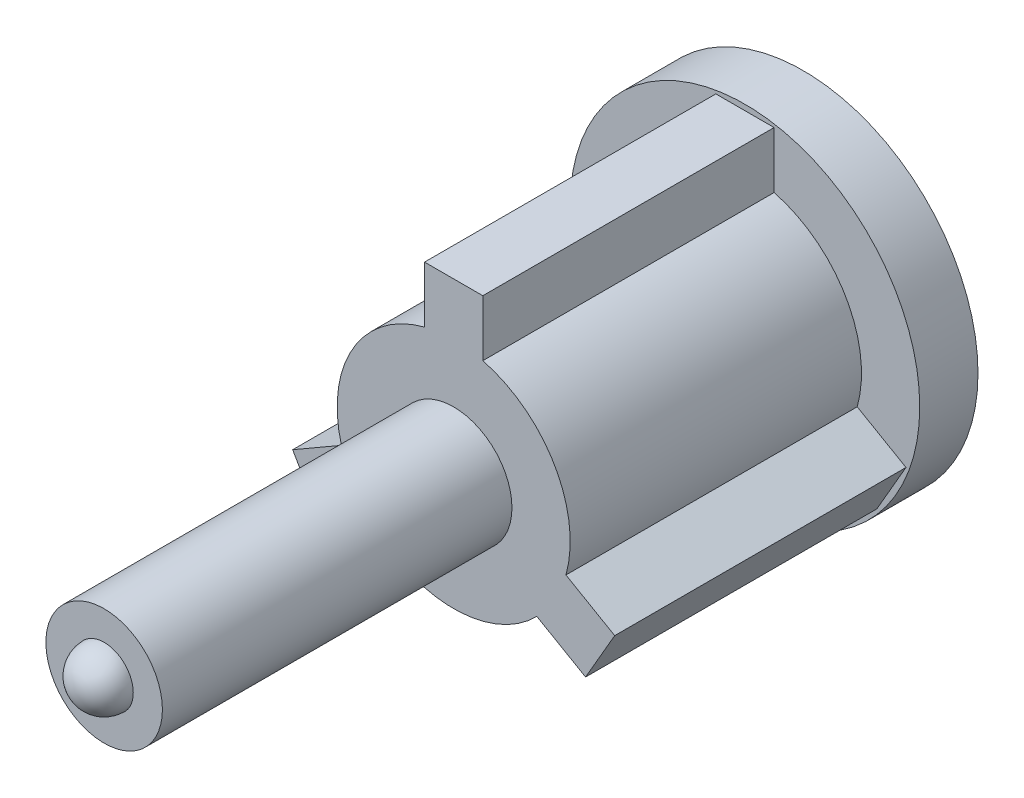
ISO-10303-21;
HEADER;
FILE_DESCRIPTION(('STEP AP214'),'2;1');
FILE_NAME('part.step','',(''),(''),'','','');
FILE_SCHEMA(('AUTOMOTIVE_DESIGN { 1 0 10303 214 1 1 1 1 }'));
ENDSEC;
DATA;
#1=APPLICATION_CONTEXT('core data for automotive mechanical design processes');
#2=APPLICATION_PROTOCOL_DEFINITION('international standard','automotive_design',2000,#1);
#3=PRODUCT_CONTEXT('',#1,'mechanical');
#4=PRODUCT('Part','Part','',(#3));
#5=PRODUCT_RELATED_PRODUCT_CATEGORY('part','',(#4));
#6=PRODUCT_DEFINITION_FORMATION('','',#4);
#7=PRODUCT_DEFINITION_CONTEXT('part definition',#1,'design');
#8=PRODUCT_DEFINITION('design','',#6,#7);
#9=PRODUCT_DEFINITION_SHAPE('','',#8);
#10=(LENGTH_UNIT() NAMED_UNIT(*) SI_UNIT(.MILLI.,.METRE.));
#11=(NAMED_UNIT(*) PLANE_ANGLE_UNIT() SI_UNIT($,.RADIAN.));
#12=(NAMED_UNIT(*) SI_UNIT($,.STERADIAN.) SOLID_ANGLE_UNIT());
#13=UNCERTAINTY_MEASURE_WITH_UNIT(LENGTH_MEASURE(1.E-05),#10,'distance_accuracy_value','');
#14=(GEOMETRIC_REPRESENTATION_CONTEXT(3) GLOBAL_UNCERTAINTY_ASSIGNED_CONTEXT((#13)) GLOBAL_UNIT_ASSIGNED_CONTEXT((#10,
#11,#12)) REPRESENTATION_CONTEXT('',''));
#15=CARTESIAN_POINT('',(0.,0.,0.));
#16=DIRECTION('',(0.,0.,1.));
#17=DIRECTION('',(1.,0.,0.));
#18=AXIS2_PLACEMENT_3D('',#15,#16,#17);
#19=CARTESIAN_POINT('',(0.,0.,1.));
#20=DIRECTION('',(0.,0.,1.));
#21=DIRECTION('',(1.,0.,0.));
#22=AXIS2_PLACEMENT_3D('',#19,#20,#21);
#23=PLANE('',#22);
#24=CARTESIAN_POINT('',(0.,0.,1.));
#25=DIRECTION('',(0.,0.,1.));
#26=DIRECTION('',(1.,0.,0.));
#27=AXIS2_PLACEMENT_3D('',#24,#25,#26);
#28=CIRCLE('',#27,3.);
#29=CARTESIAN_POINT('',(3.,0.,1.));
#30=VERTEX_POINT('',#29);
#31=EDGE_CURVE('E212',#30,#30,#28,.T.);
#32=ORIENTED_EDGE('',*,*,#31,.T.);
#33=EDGE_LOOP('',(#32));
#34=FACE_BOUND('',#33,.T.);
#35=DIRECTION('',(0.499999999999992,-0.866025403784443,0.));
#36=VECTOR('',#35,1.);
#37=CARTESIAN_POINT('',(-2.26381957910646,-1.88436711258346,1.));
#38=LINE('',#37,#36);
#39=CARTESIAN_POINT('',(-2.76381957910646,-1.01834170879901,1.));
#40=VERTEX_POINT('',#39);
#41=CARTESIAN_POINT('',(-2.26381957910646,-1.88436711258346,1.));
#42=VERTEX_POINT('',#41);
#43=EDGE_CURVE('E298',#40,#42,#38,.T.);
#44=ORIENTED_EDGE('',*,*,#43,.F.);
#45=DIRECTION('',(-0.866025403784443,-0.499999999999992,0.));
#46=VECTOR('',#45,1.);
#47=CARTESIAN_POINT('',(-2.76381957910646,-1.01834170879901,1.));
#48=LINE('',#47,#46);
#49=CARTESIAN_POINT('',(-1.92705098312485,-0.535233134659617,1.));
#50=VERTEX_POINT('',#49);
#51=EDGE_CURVE('E145',#50,#40,#48,.T.);
#52=ORIENTED_EDGE('',*,*,#51,.F.);
#53=CARTESIAN_POINT('',(0.,0.,1.));
#54=DIRECTION('',(0.,0.,1.));
#55=DIRECTION('',(1.,0.,0.));
#56=AXIS2_PLACEMENT_3D('',#53,#54,#55);
#57=CIRCLE('',#56,2.);
#58=CARTESIAN_POINT('',(-0.5,1.93649167310371,1.));
#59=VERTEX_POINT('',#58);
#60=EDGE_CURVE('E206',#59,#50,#57,.T.);
#61=ORIENTED_EDGE('',*,*,#60,.F.);
#62=DIRECTION('',(0.,-1.,0.));
#63=VECTOR('',#62,1.);
#64=CARTESIAN_POINT('',(-0.5,2.90270882138252,1.));
#65=LINE('',#64,#63);
#66=CARTESIAN_POINT('',(-0.5,2.90270882138252,1.));
#67=VERTEX_POINT('',#66);
#68=EDGE_CURVE('E180',#67,#59,#65,.T.);
#69=ORIENTED_EDGE('',*,*,#68,.F.);
#70=DIRECTION('',(-1.,0.,0.));
#71=VECTOR('',#70,1.);
#72=CARTESIAN_POINT('',(-0.5,2.90270882138252,1.));
#73=LINE('',#72,#71);
#74=CARTESIAN_POINT('',(0.5,2.90270882138252,1.));
#75=VERTEX_POINT('',#74);
#76=EDGE_CURVE('E186',#75,#67,#73,.T.);
#77=ORIENTED_EDGE('',*,*,#76,.F.);
#78=DIRECTION('',(0.,1.,0.));
#79=VECTOR('',#78,1.);
#80=CARTESIAN_POINT('',(0.5,2.90270882138252,1.));
#81=LINE('',#80,#79);
#82=CARTESIAN_POINT('',(0.5,1.93649167310371,1.));
#83=VERTEX_POINT('',#82);
#84=EDGE_CURVE('E176',#83,#75,#81,.T.);
#85=ORIENTED_EDGE('',*,*,#84,.F.);
#86=CARTESIAN_POINT('',(1.92705098312484,-0.535233134659643,1.));
#87=VERTEX_POINT('',#86);
#88=EDGE_CURVE('E211',#87,#83,#57,.T.);
#89=ORIENTED_EDGE('',*,*,#88,.F.);
#90=DIRECTION('',(-0.866025403784436,0.500000000000004,0.));
#91=VECTOR('',#90,1.);
#92=CARTESIAN_POINT('',(2.76381957910644,-1.01834170879905,1.));
#93=LINE('',#92,#91);
#94=CARTESIAN_POINT('',(2.76381957910644,-1.01834170879905,1.));
#95=VERTEX_POINT('',#94);
#96=EDGE_CURVE('E158',#95,#87,#93,.T.);
#97=ORIENTED_EDGE('',*,*,#96,.F.);
#98=DIRECTION('',(0.500000000000004,0.866025403784436,0.));
#99=VECTOR('',#98,1.);
#100=CARTESIAN_POINT('',(2.76381957910644,-1.01834170879905,1.));
#101=LINE('',#100,#99);
#102=CARTESIAN_POINT('',(2.26381957910644,-1.88436711258349,1.));
#103=VERTEX_POINT('',#102);
#104=EDGE_CURVE('E163',#103,#95,#101,.T.);
#105=ORIENTED_EDGE('',*,*,#104,.F.);
#106=DIRECTION('',(0.866025403784436,-0.500000000000004,0.));
#107=VECTOR('',#106,1.);
#108=CARTESIAN_POINT('',(2.26381957910644,-1.88436711258349,1.));
#109=LINE('',#108,#107);
#110=CARTESIAN_POINT('',(1.42705098312484,-1.40125853844408,1.));
#111=VERTEX_POINT('',#110);
#112=EDGE_CURVE('E154',#111,#103,#109,.T.);
#113=ORIENTED_EDGE('',*,*,#112,.F.);
#114=CARTESIAN_POINT('',(-1.42705098312486,-1.40125853844406,1.));
#115=VERTEX_POINT('',#114);
#116=EDGE_CURVE('E210',#115,#111,#57,.T.);
#117=ORIENTED_EDGE('',*,*,#116,.F.);
#118=DIRECTION('',(0.866025403784443,0.499999999999992,0.));
#119=VECTOR('',#118,1.);
#120=CARTESIAN_POINT('',(-2.26381957910646,-1.88436711258346,1.));
#121=LINE('',#120,#119);
#122=EDGE_CURVE('E133',#42,#115,#121,.T.);
#123=ORIENTED_EDGE('',*,*,#122,.F.);
#124=EDGE_LOOP('',(#44,#52,#61,#69,#77,#85,#89,#97,#105,#113,#117,#123));
#125=FACE_BOUND('',#124,.T.);
#126=ADVANCED_FACE('F34',(#34,#125),#23,.T.);
#127=CARTESIAN_POINT('',(0.,0.,6.));
#128=DIRECTION('',(0.,0.,-1.));
#129=DIRECTION('',(-1.,0.,0.));
#130=AXIS2_PLACEMENT_3D('',#127,#128,#129);
#131=CYLINDRICAL_SURFACE('',#130,2.);
#132=DIRECTION('',(0.,0.,-1.));
#133=VECTOR('',#132,1.);
#134=CARTESIAN_POINT('',(-1.92705098312485,-0.535233134659617,6.));
#135=LINE('',#134,#133);
#136=CARTESIAN_POINT('',(-1.92705098312485,-0.535233134659617,6.));
#137=VERTEX_POINT('',#136);
#138=EDGE_CURVE('E148',#137,#50,#135,.T.);
#139=ORIENTED_EDGE('',*,*,#138,.F.);
#140=CARTESIAN_POINT('',(0.,0.,6.));
#141=DIRECTION('',(0.,0.,1.));
#142=DIRECTION('',(1.,0.,0.));
#143=AXIS2_PLACEMENT_3D('',#140,#141,#142);
#144=CIRCLE('',#143,2.);
#145=CARTESIAN_POINT('',(-0.5,1.93649167310371,6.));
#146=VERTEX_POINT('',#145);
#147=EDGE_CURVE('E129',#146,#137,#144,.T.);
#148=ORIENTED_EDGE('',*,*,#147,.F.);
#149=DIRECTION('',(0.,0.,-1.));
#150=VECTOR('',#149,1.);
#151=CARTESIAN_POINT('',(-0.5,1.93649167310371,6.));
#152=LINE('',#151,#150);
#153=EDGE_CURVE('E194',#59,#146,#152,.F.);
#154=ORIENTED_EDGE('',*,*,#153,.F.);
#155=ORIENTED_EDGE('',*,*,#60,.T.);
#156=EDGE_LOOP('',(#139,#148,#154,#155));
#157=FACE_BOUND('',#156,.T.);
#158=ADVANCED_FACE('F236',(#157),#131,.T.);
#159=DIRECTION('',(0.,0.,-1.));
#160=VECTOR('',#159,1.);
#161=CARTESIAN_POINT('',(-1.42705098312486,-1.40125853844406,6.));
#162=LINE('',#161,#160);
#163=CARTESIAN_POINT('',(-1.42705098312486,-1.40125853844406,6.));
#164=VERTEX_POINT('',#163);
#165=EDGE_CURVE('E146',#115,#164,#162,.F.);
#166=ORIENTED_EDGE('',*,*,#165,.F.);
#167=ORIENTED_EDGE('',*,*,#116,.T.);
#168=DIRECTION('',(0.,0.,-1.));
#169=VECTOR('',#168,1.);
#170=CARTESIAN_POINT('',(1.42705098312484,-1.40125853844408,6.));
#171=LINE('',#170,#169);
#172=CARTESIAN_POINT('',(1.42705098312484,-1.40125853844408,6.));
#173=VERTEX_POINT('',#172);
#174=EDGE_CURVE('E173',#173,#111,#171,.T.);
#175=ORIENTED_EDGE('',*,*,#174,.F.);
#176=EDGE_CURVE('E208',#164,#173,#144,.T.);
#177=ORIENTED_EDGE('',*,*,#176,.F.);
#178=EDGE_LOOP('',(#166,#167,#175,#177));
#179=FACE_BOUND('',#178,.T.);
#180=ADVANCED_FACE('F240',(#179),#131,.T.);
#181=DIRECTION('',(0.,0.,-1.));
#182=VECTOR('',#181,1.);
#183=CARTESIAN_POINT('',(1.92705098312484,-0.535233134659643,6.));
#184=LINE('',#183,#182);
#185=CARTESIAN_POINT('',(1.92705098312484,-0.535233134659643,6.));
#186=VERTEX_POINT('',#185);
#187=EDGE_CURVE('E171',#87,#186,#184,.F.);
#188=ORIENTED_EDGE('',*,*,#187,.F.);
#189=ORIENTED_EDGE('',*,*,#88,.T.);
#190=DIRECTION('',(0.,0.,-1.));
#191=VECTOR('',#190,1.);
#192=CARTESIAN_POINT('',(0.5,1.93649167310371,6.));
#193=LINE('',#192,#191);
#194=CARTESIAN_POINT('',(0.5,1.93649167310371,6.));
#195=VERTEX_POINT('',#194);
#196=EDGE_CURVE('E197',#195,#83,#193,.T.);
#197=ORIENTED_EDGE('',*,*,#196,.F.);
#198=EDGE_CURVE('E203',#186,#195,#144,.T.);
#199=ORIENTED_EDGE('',*,*,#198,.F.);
#200=EDGE_LOOP('',(#188,#189,#197,#199));
#201=FACE_BOUND('',#200,.T.);
#202=ADVANCED_FACE('F231',(#201),#131,.T.);
#203=CARTESIAN_POINT('',(0.,0.,1.));
#204=DIRECTION('',(0.,0.,-1.));
#205=DIRECTION('',(-1.,0.,0.));
#206=AXIS2_PLACEMENT_3D('',#203,#204,#205);
#207=CYLINDRICAL_SURFACE('',#206,3.);
#208=ORIENTED_EDGE('',*,*,#31,.F.);
#209=EDGE_LOOP('',(#208));
#210=FACE_BOUND('',#209,.T.);
#211=CARTESIAN_POINT('',(0.,0.,0.));
#212=DIRECTION('',(0.,0.,1.));
#213=DIRECTION('',(1.,0.,0.));
#214=AXIS2_PLACEMENT_3D('',#211,#212,#213);
#215=CIRCLE('',#214,3.);
#216=CARTESIAN_POINT('',(3.,0.,0.));
#217=VERTEX_POINT('',#216);
#218=EDGE_CURVE('E38',#217,#217,#215,.T.);
#219=ORIENTED_EDGE('',*,*,#218,.T.);
#220=EDGE_LOOP('',(#219));
#221=FACE_BOUND('',#220,.T.);
#222=ADVANCED_FACE('F219',(#210,#221),#207,.T.);
#223=CARTESIAN_POINT('',(0.,0.,0.));
#224=DIRECTION('',(0.,0.,1.));
#225=DIRECTION('',(1.,0.,0.));
#226=AXIS2_PLACEMENT_3D('',#223,#224,#225);
#227=PLANE('',#226);
#228=CARTESIAN_POINT('',(0.,0.,0.));
#229=DIRECTION('',(0.,0.,-1.));
#230=DIRECTION('',(-1.,0.,0.));
#231=AXIS2_PLACEMENT_3D('',#228,#229,#230);
#232=CIRCLE('',#231,1.5);
#233=CARTESIAN_POINT('',(-1.5,0.,0.));
#234=VERTEX_POINT('',#233);
#235=EDGE_CURVE('E296',#234,#234,#232,.T.);
#236=ORIENTED_EDGE('',*,*,#235,.F.);
#237=EDGE_LOOP('',(#236));
#238=FACE_BOUND('',#237,.T.);
#239=ORIENTED_EDGE('',*,*,#218,.F.);
#240=EDGE_LOOP('',(#239));
#241=FACE_BOUND('',#240,.T.);
#242=ADVANCED_FACE('F221',(#238,#241),#227,.F.);
#243=CARTESIAN_POINT('',(0.,0.,6.));
#244=DIRECTION('',(0.,0.,1.));
#245=DIRECTION('',(1.,0.,0.));
#246=AXIS2_PLACEMENT_3D('',#243,#244,#245);
#247=PLANE('',#246);
#248=ORIENTED_EDGE('',*,*,#147,.T.);
#249=DIRECTION('',(-0.866025403784443,-0.499999999999992,0.));
#250=VECTOR('',#249,1.);
#251=CARTESIAN_POINT('',(-2.76381957910646,-1.01834170879901,6.));
#252=LINE('',#251,#250);
#253=CARTESIAN_POINT('',(-2.76381957910646,-1.01834170879901,6.));
#254=VERTEX_POINT('',#253);
#255=EDGE_CURVE('E122',#137,#254,#252,.T.);
#256=ORIENTED_EDGE('',*,*,#255,.T.);
#257=DIRECTION('',(0.499999999999992,-0.866025403784443,0.));
#258=VECTOR('',#257,1.);
#259=CARTESIAN_POINT('',(-2.26381957910646,-1.88436711258346,6.));
#260=LINE('',#259,#258);
#261=CARTESIAN_POINT('',(-2.26381957910646,-1.88436711258346,6.));
#262=VERTEX_POINT('',#261);
#263=EDGE_CURVE('E126',#254,#262,#260,.T.);
#264=ORIENTED_EDGE('',*,*,#263,.T.);
#265=DIRECTION('',(0.866025403784443,0.499999999999992,0.));
#266=VECTOR('',#265,1.);
#267=CARTESIAN_POINT('',(-2.26381957910646,-1.88436711258346,6.));
#268=LINE('',#267,#266);
#269=EDGE_CURVE('E51',#262,#164,#268,.T.);
#270=ORIENTED_EDGE('',*,*,#269,.T.);
#271=ORIENTED_EDGE('',*,*,#176,.T.);
#272=DIRECTION('',(0.866025403784436,-0.500000000000004,0.));
#273=VECTOR('',#272,1.);
#274=CARTESIAN_POINT('',(2.26381957910644,-1.88436711258349,6.));
#275=LINE('',#274,#273);
#276=CARTESIAN_POINT('',(2.26381957910644,-1.88436711258349,6.));
#277=VERTEX_POINT('',#276);
#278=EDGE_CURVE('E155',#173,#277,#275,.T.);
#279=ORIENTED_EDGE('',*,*,#278,.T.);
#280=DIRECTION('',(0.500000000000004,0.866025403784436,0.));
#281=VECTOR('',#280,1.);
#282=CARTESIAN_POINT('',(2.76381957910644,-1.01834170879905,6.));
#283=LINE('',#282,#281);
#284=CARTESIAN_POINT('',(2.76381957910644,-1.01834170879905,6.));
#285=VERTEX_POINT('',#284);
#286=EDGE_CURVE('E157',#277,#285,#283,.T.);
#287=ORIENTED_EDGE('',*,*,#286,.T.);
#288=DIRECTION('',(-0.866025403784436,0.500000000000004,0.));
#289=VECTOR('',#288,1.);
#290=CARTESIAN_POINT('',(2.76381957910644,-1.01834170879905,6.));
#291=LINE('',#290,#289);
#292=EDGE_CURVE('E58',#285,#186,#291,.T.);
#293=ORIENTED_EDGE('',*,*,#292,.T.);
#294=ORIENTED_EDGE('',*,*,#198,.T.);
#295=DIRECTION('',(0.,1.,0.));
#296=VECTOR('',#295,1.);
#297=CARTESIAN_POINT('',(0.5,2.90270882138252,6.));
#298=LINE('',#297,#296);
#299=CARTESIAN_POINT('',(0.5,2.90270882138252,6.));
#300=VERTEX_POINT('',#299);
#301=EDGE_CURVE('E177',#195,#300,#298,.T.);
#302=ORIENTED_EDGE('',*,*,#301,.T.);
#303=DIRECTION('',(-1.,0.,0.));
#304=VECTOR('',#303,1.);
#305=CARTESIAN_POINT('',(-0.5,2.90270882138252,6.));
#306=LINE('',#305,#304);
#307=CARTESIAN_POINT('',(-0.5,2.90270882138252,6.));
#308=VERTEX_POINT('',#307);
#309=EDGE_CURVE('E179',#300,#308,#306,.T.);
#310=ORIENTED_EDGE('',*,*,#309,.T.);
#311=DIRECTION('',(0.,-1.,0.));
#312=VECTOR('',#311,1.);
#313=CARTESIAN_POINT('',(-0.5,2.90270882138252,6.));
#314=LINE('',#313,#312);
#315=EDGE_CURVE('E182',#308,#146,#314,.T.);
#316=ORIENTED_EDGE('',*,*,#315,.T.);
#317=EDGE_LOOP('',(#248,#256,#264,#270,#271,#279,#287,#293,#294,#302,#310,#316));
#318=FACE_BOUND('',#317,.T.);
#319=CARTESIAN_POINT('',(0.,0.,6.));
#320=DIRECTION('',(0.,0.,1.));
#321=DIRECTION('',(1.,0.,0.));
#322=AXIS2_PLACEMENT_3D('',#319,#320,#321);
#323=CIRCLE('',#322,1.);
#324=CARTESIAN_POINT('',(1.,0.,6.));
#325=VERTEX_POINT('',#324);
#326=EDGE_CURVE('E43',#325,#325,#323,.T.);
#327=ORIENTED_EDGE('',*,*,#326,.F.);
#328=EDGE_LOOP('',(#327));
#329=FACE_BOUND('',#328,.T.);
#330=ADVANCED_FACE('F124',(#318,#329),#247,.T.);
#331=CARTESIAN_POINT('',(0.,0.,12.));
#332=DIRECTION('',(0.,0.,-1.));
#333=DIRECTION('',(-1.,0.,0.));
#334=AXIS2_PLACEMENT_3D('',#331,#332,#333);
#335=CYLINDRICAL_SURFACE('',#334,1.);
#336=CARTESIAN_POINT('',(0.,0.,12.));
#337=DIRECTION('',(0.,0.,1.));
#338=DIRECTION('',(1.,0.,0.));
#339=AXIS2_PLACEMENT_3D('',#336,#337,#338);
#340=CIRCLE('',#339,1.);
#341=CARTESIAN_POINT('',(1.,0.,12.));
#342=VERTEX_POINT('',#341);
#343=EDGE_CURVE('E199',#342,#342,#340,.T.);
#344=ORIENTED_EDGE('',*,*,#343,.F.);
#345=EDGE_LOOP('',(#344));
#346=FACE_BOUND('',#345,.T.);
#347=ORIENTED_EDGE('',*,*,#326,.T.);
#348=EDGE_LOOP('',(#347));
#349=FACE_BOUND('',#348,.T.);
#350=ADVANCED_FACE('F229',(#346,#349),#335,.T.);
#351=CARTESIAN_POINT('',(0.,0.,12.));
#352=DIRECTION('',(0.,0.,1.));
#353=DIRECTION('',(1.,0.,0.));
#354=AXIS2_PLACEMENT_3D('',#351,#352,#353);
#355=PLANE('',#354);
#356=CARTESIAN_POINT('',(0.,0.,12.));
#357=DIRECTION('',(0.,0.,1.));
#358=DIRECTION('',(1.,0.,0.));
#359=AXIS2_PLACEMENT_3D('',#356,#357,#358);
#360=CIRCLE('',#359,0.5);
#361=CARTESIAN_POINT('',(0.5,0.,12.));
#362=VERTEX_POINT('',#361);
#363=EDGE_CURVE('E11',#362,#362,#360,.T.);
#364=ORIENTED_EDGE('',*,*,#363,.F.);
#365=EDGE_LOOP('',(#364));
#366=FACE_BOUND('',#365,.T.);
#367=ORIENTED_EDGE('',*,*,#343,.T.);
#368=EDGE_LOOP('',(#367));
#369=FACE_BOUND('',#368,.T.);
#370=ADVANCED_FACE('F247',(#366,#369),#355,.T.);
#371=CARTESIAN_POINT('',(0.,0.,12.));
#372=DIRECTION('',(0.,0.,1.));
#373=DIRECTION('',(1.,0.,0.));
#374=AXIS2_PLACEMENT_3D('',#371,#372,#373);
#375=SPHERICAL_SURFACE('',#374,0.5);
#376=ORIENTED_EDGE('',*,*,#363,.T.);
#377=EDGE_LOOP('',(#376));
#378=FACE_BOUND('',#377,.T.);
#379=ADVANCED_FACE('F36',(#378),#375,.T.);
#380=CARTESIAN_POINT('',(0.5,2.90270882138252,6.));
#381=DIRECTION('',(-1.,0.,0.));
#382=DIRECTION('',(0.,-1.,0.));
#383=AXIS2_PLACEMENT_3D('',#380,#381,#382);
#384=PLANE('',#383);
#385=ORIENTED_EDGE('',*,*,#301,.F.);
#386=ORIENTED_EDGE('',*,*,#196,.T.);
#387=ORIENTED_EDGE('',*,*,#84,.T.);
#388=DIRECTION('',(0.,0.,-1.));
#389=VECTOR('',#388,1.);
#390=CARTESIAN_POINT('',(0.5,2.90270882138252,6.));
#391=LINE('',#390,#389);
#392=EDGE_CURVE('E191',#300,#75,#391,.T.);
#393=ORIENTED_EDGE('',*,*,#392,.F.);
#394=EDGE_LOOP('',(#385,#386,#387,#393));
#395=FACE_BOUND('',#394,.T.);
#396=ADVANCED_FACE('F252',(#395),#384,.F.);
#397=CARTESIAN_POINT('',(-0.5,2.90270882138252,6.));
#398=DIRECTION('',(1.,0.,0.));
#399=DIRECTION('',(0.,0.,-1.));
#400=AXIS2_PLACEMENT_3D('',#397,#398,#399);
#401=PLANE('',#400);
#402=ORIENTED_EDGE('',*,*,#68,.T.);
#403=ORIENTED_EDGE('',*,*,#153,.T.);
#404=ORIENTED_EDGE('',*,*,#315,.F.);
#405=DIRECTION('',(0.,0.,-1.));
#406=VECTOR('',#405,1.);
#407=CARTESIAN_POINT('',(-0.5,2.90270882138252,6.));
#408=LINE('',#407,#406);
#409=EDGE_CURVE('E184',#308,#67,#408,.T.);
#410=ORIENTED_EDGE('',*,*,#409,.T.);
#411=EDGE_LOOP('',(#402,#403,#404,#410));
#412=FACE_BOUND('',#411,.T.);
#413=ADVANCED_FACE('F255',(#412),#401,.F.);
#414=CARTESIAN_POINT('',(-0.5,2.90270882138252,6.));
#415=DIRECTION('',(0.,-1.,0.));
#416=DIRECTION('',(0.,0.,-1.));
#417=AXIS2_PLACEMENT_3D('',#414,#415,#416);
#418=PLANE('',#417);
#419=ORIENTED_EDGE('',*,*,#76,.T.);
#420=ORIENTED_EDGE('',*,*,#409,.F.);
#421=ORIENTED_EDGE('',*,*,#309,.F.);
#422=ORIENTED_EDGE('',*,*,#392,.T.);
#423=EDGE_LOOP('',(#419,#420,#421,#422));
#424=FACE_BOUND('',#423,.T.);
#425=ADVANCED_FACE('F257',(#424),#418,.F.);
#426=CARTESIAN_POINT('',(2.26381957910644,-1.88436711258349,6.));
#427=DIRECTION('',(0.500000000000004,0.866025403784436,0.));
#428=DIRECTION('',(-0.866025403784436,0.500000000000004,0.));
#429=AXIS2_PLACEMENT_3D('',#426,#427,#428);
#430=PLANE('',#429);
#431=ORIENTED_EDGE('',*,*,#278,.F.);
#432=ORIENTED_EDGE('',*,*,#174,.T.);
#433=ORIENTED_EDGE('',*,*,#112,.T.);
#434=DIRECTION('',(0.,0.,-1.));
#435=VECTOR('',#434,1.);
#436=CARTESIAN_POINT('',(2.26381957910644,-1.88436711258349,6.));
#437=LINE('',#436,#435);
#438=EDGE_CURVE('E168',#277,#103,#437,.T.);
#439=ORIENTED_EDGE('',*,*,#438,.F.);
#440=EDGE_LOOP('',(#431,#432,#433,#439));
#441=FACE_BOUND('',#440,.T.);
#442=ADVANCED_FACE('F260',(#441),#430,.F.);
#443=CARTESIAN_POINT('',(2.76381957910644,-1.01834170879905,6.));
#444=DIRECTION('',(-0.500000000000004,-0.866025403784436,0.));
#445=DIRECTION('',(0.866025403784436,-0.500000000000004,0.));
#446=AXIS2_PLACEMENT_3D('',#443,#444,#445);
#447=PLANE('',#446);
#448=ORIENTED_EDGE('',*,*,#96,.T.);
#449=ORIENTED_EDGE('',*,*,#187,.T.);
#450=ORIENTED_EDGE('',*,*,#292,.F.);
#451=DIRECTION('',(0.,0.,-1.));
#452=VECTOR('',#451,1.);
#453=CARTESIAN_POINT('',(2.76381957910644,-1.01834170879905,6.));
#454=LINE('',#453,#452);
#455=EDGE_CURVE('E161',#285,#95,#454,.T.);
#456=ORIENTED_EDGE('',*,*,#455,.T.);
#457=EDGE_LOOP('',(#448,#449,#450,#456));
#458=FACE_BOUND('',#457,.T.);
#459=ADVANCED_FACE('F267',(#458),#447,.F.);
#460=CARTESIAN_POINT('',(2.76381957910644,-1.01834170879905,6.));
#461=DIRECTION('',(-0.866025403784436,0.500000000000004,0.));
#462=DIRECTION('',(-0.500000000000004,-0.866025403784436,0.));
#463=AXIS2_PLACEMENT_3D('',#460,#461,#462);
#464=PLANE('',#463);
#465=ORIENTED_EDGE('',*,*,#104,.T.);
#466=ORIENTED_EDGE('',*,*,#455,.F.);
#467=ORIENTED_EDGE('',*,*,#286,.F.);
#468=ORIENTED_EDGE('',*,*,#438,.T.);
#469=EDGE_LOOP('',(#465,#466,#467,#468));
#470=FACE_BOUND('',#469,.T.);
#471=ADVANCED_FACE('F269',(#470),#464,.F.);
#472=CARTESIAN_POINT('',(-2.76381957910646,-1.01834170879901,6.));
#473=DIRECTION('',(0.499999999999992,-0.866025403784443,0.));
#474=DIRECTION('',(0.866025403784443,0.499999999999992,0.));
#475=AXIS2_PLACEMENT_3D('',#472,#473,#474);
#476=PLANE('',#475);
#477=ORIENTED_EDGE('',*,*,#255,.F.);
#478=ORIENTED_EDGE('',*,*,#138,.T.);
#479=ORIENTED_EDGE('',*,*,#51,.T.);
#480=DIRECTION('',(0.,0.,-1.));
#481=VECTOR('',#480,1.);
#482=CARTESIAN_POINT('',(-2.76381957910646,-1.01834170879901,6.));
#483=LINE('',#482,#481);
#484=EDGE_CURVE('E138',#254,#40,#483,.T.);
#485=ORIENTED_EDGE('',*,*,#484,.F.);
#486=EDGE_LOOP('',(#477,#478,#479,#485));
#487=FACE_BOUND('',#486,.T.);
#488=ADVANCED_FACE('F143',(#487),#476,.F.);
#489=CARTESIAN_POINT('',(-2.26381957910646,-1.88436711258346,6.));
#490=DIRECTION('',(-0.499999999999992,0.866025403784443,0.));
#491=DIRECTION('',(-0.866025403784443,-0.499999999999992,0.));
#492=AXIS2_PLACEMENT_3D('',#489,#490,#491);
#493=PLANE('',#492);
#494=ORIENTED_EDGE('',*,*,#122,.T.);
#495=ORIENTED_EDGE('',*,*,#165,.T.);
#496=ORIENTED_EDGE('',*,*,#269,.F.);
#497=DIRECTION('',(0.,0.,-1.));
#498=VECTOR('',#497,1.);
#499=CARTESIAN_POINT('',(-2.26381957910646,-1.88436711258346,6.));
#500=LINE('',#499,#498);
#501=EDGE_CURVE('E141',#262,#42,#500,.T.);
#502=ORIENTED_EDGE('',*,*,#501,.T.);
#503=EDGE_LOOP('',(#494,#495,#496,#502));
#504=FACE_BOUND('',#503,.T.);
#505=ADVANCED_FACE('F278',(#504),#493,.F.);
#506=CARTESIAN_POINT('',(-2.26381957910646,-1.88436711258346,6.));
#507=DIRECTION('',(0.866025403784443,0.499999999999992,0.));
#508=DIRECTION('',(-0.499999999999992,0.866025403784443,0.));
#509=AXIS2_PLACEMENT_3D('',#506,#507,#508);
#510=PLANE('',#509);
#511=ORIENTED_EDGE('',*,*,#43,.T.);
#512=ORIENTED_EDGE('',*,*,#501,.F.);
#513=ORIENTED_EDGE('',*,*,#263,.F.);
#514=ORIENTED_EDGE('',*,*,#484,.T.);
#515=EDGE_LOOP('',(#511,#512,#513,#514));
#516=FACE_BOUND('',#515,.T.);
#517=ADVANCED_FACE('F137',(#516),#510,.F.);
#518=CARTESIAN_POINT('',(0.,0.,5.));
#519=DIRECTION('',(0.,0.,-1.));
#520=DIRECTION('',(-1.,0.,0.));
#521=AXIS2_PLACEMENT_3D('',#518,#519,#520);
#522=CYLINDRICAL_SURFACE('',#521,1.5);
#523=CARTESIAN_POINT('',(0.,0.,5.));
#524=DIRECTION('',(0.,0.,-1.));
#525=DIRECTION('',(-1.,0.,0.));
#526=AXIS2_PLACEMENT_3D('',#523,#524,#525);
#527=CIRCLE('',#526,1.5);
#528=CARTESIAN_POINT('',(-1.5,0.,5.));
#529=VERTEX_POINT('',#528);
#530=EDGE_CURVE('E295',#529,#529,#527,.T.);
#531=ORIENTED_EDGE('',*,*,#530,.F.);
#532=EDGE_LOOP('',(#531));
#533=FACE_BOUND('',#532,.T.);
#534=ORIENTED_EDGE('',*,*,#235,.T.);
#535=EDGE_LOOP('',(#534));
#536=FACE_BOUND('',#535,.T.);
#537=ADVANCED_FACE('F281',(#533,#536),#522,.F.);
#538=CARTESIAN_POINT('',(0.,0.,5.));
#539=DIRECTION('',(0.,0.,-1.));
#540=DIRECTION('',(-1.,0.,0.));
#541=AXIS2_PLACEMENT_3D('',#538,#539,#540);
#542=PLANE('',#541);
#543=ORIENTED_EDGE('',*,*,#530,.T.);
#544=EDGE_LOOP('',(#543));
#545=FACE_BOUND('',#544,.T.);
#546=ADVANCED_FACE('F287',(#545),#542,.T.);
#547=CLOSED_SHELL('',(#126,#158,#180,#202,#222,#242,#330,#350,#370,#379,#396,#413,#425,#442,
#459,#471,#488,#505,#517,#537,#546));
#548=MANIFOLD_SOLID_BREP('B2',#547);
#549=ADVANCED_BREP_SHAPE_REPRESENTATION('',(#18,#548),#14);
#550=SHAPE_DEFINITION_REPRESENTATION(#9,#549);
ENDSEC;
END-ISO-10303-21;
